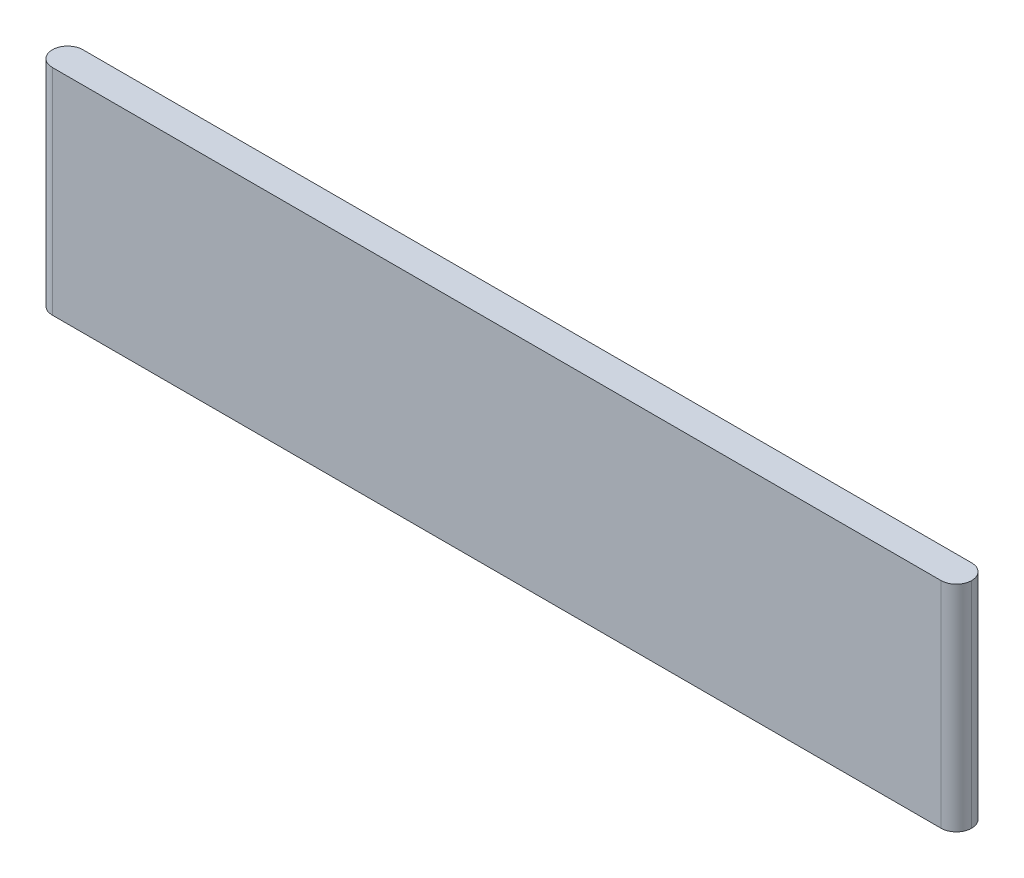
ISO-10303-21;
HEADER;
FILE_DESCRIPTION(('STEP AP214'),'2;1');
FILE_NAME('part.step','',(''),(''),'','','');
FILE_SCHEMA(('AUTOMOTIVE_DESIGN { 1 0 10303 214 1 1 1 1 }'));
ENDSEC;
DATA;
#1=APPLICATION_CONTEXT('core data for automotive mechanical design processes');
#2=APPLICATION_PROTOCOL_DEFINITION('international standard','automotive_design',2000,#1);
#3=PRODUCT_CONTEXT('',#1,'mechanical');
#4=PRODUCT('Part','Part','',(#3));
#5=PRODUCT_RELATED_PRODUCT_CATEGORY('part','',(#4));
#6=PRODUCT_DEFINITION_FORMATION('','',#4);
#7=PRODUCT_DEFINITION_CONTEXT('part definition',#1,'design');
#8=PRODUCT_DEFINITION('design','',#6,#7);
#9=PRODUCT_DEFINITION_SHAPE('','',#8);
#10=(LENGTH_UNIT() NAMED_UNIT(*) SI_UNIT(.MILLI.,.METRE.));
#11=(NAMED_UNIT(*) PLANE_ANGLE_UNIT() SI_UNIT($,.RADIAN.));
#12=(NAMED_UNIT(*) SI_UNIT($,.STERADIAN.) SOLID_ANGLE_UNIT());
#13=UNCERTAINTY_MEASURE_WITH_UNIT(LENGTH_MEASURE(1.E-05),#10,'distance_accuracy_value','');
#14=(GEOMETRIC_REPRESENTATION_CONTEXT(3) GLOBAL_UNCERTAINTY_ASSIGNED_CONTEXT((#13)) GLOBAL_UNIT_ASSIGNED_CONTEXT((#10,
#11,#12)) REPRESENTATION_CONTEXT('',''));
#15=CARTESIAN_POINT('',(0.,0.,0.));
#16=DIRECTION('',(0.,0.,1.));
#17=DIRECTION('',(1.,0.,0.));
#18=AXIS2_PLACEMENT_3D('',#15,#16,#17);
#19=CARTESIAN_POINT('',(-750.,175.,50.0000000000006));
#20=DIRECTION('',(0.,-1.,0.));
#21=DIRECTION('',(1.,0.,0.));
#22=AXIS2_PLACEMENT_3D('',#19,#20,#21);
#23=PLANE('',#22);
#24=CARTESIAN_POINT('',(725.,175.,25.0000000000006));
#25=DIRECTION('',(0.,-1.,0.));
#26=DIRECTION('',(1.,0.,0.));
#27=AXIS2_PLACEMENT_3D('',#24,#25,#26);
#28=CIRCLE('',#27,25.);
#29=CARTESIAN_POINT('',(725.,175.,50.0000000000006));
#30=VERTEX_POINT('',#29);
#31=CARTESIAN_POINT('',(750.,175.,25.0000000000006));
#32=VERTEX_POINT('',#31);
#33=EDGE_CURVE('E101',#30,#32,#28,.F.);
#34=ORIENTED_EDGE('',*,*,#33,.T.);
#35=CARTESIAN_POINT('',(725.,175.,25.0000000000006));
#36=DIRECTION('',(0.,-1.,0.));
#37=DIRECTION('',(1.,0.,0.));
#38=AXIS2_PLACEMENT_3D('',#35,#36,#37);
#39=CIRCLE('',#38,25.);
#40=CARTESIAN_POINT('',(725.,175.,6.11009234297548E-13));
#41=VERTEX_POINT('',#40);
#42=EDGE_CURVE('E96',#32,#41,#39,.F.);
#43=ORIENTED_EDGE('',*,*,#42,.T.);
#44=DIRECTION('',(-1.,0.,0.));
#45=VECTOR('',#44,1.);
#46=CARTESIAN_POINT('',(-750.,175.,6.11009234297548E-13));
#47=LINE('',#46,#45);
#48=CARTESIAN_POINT('',(-725.,175.,6.11009234297548E-13));
#49=VERTEX_POINT('',#48);
#50=EDGE_CURVE('E98',#41,#49,#47,.T.);
#51=ORIENTED_EDGE('',*,*,#50,.T.);
#52=CARTESIAN_POINT('',(-725.,175.,25.0000000000006));
#53=DIRECTION('',(0.,-1.,0.));
#54=DIRECTION('',(1.,0.,0.));
#55=AXIS2_PLACEMENT_3D('',#52,#53,#54);
#56=CIRCLE('',#55,25.);
#57=CARTESIAN_POINT('',(-750.,175.,25.0000000000006));
#58=VERTEX_POINT('',#57);
#59=EDGE_CURVE('E144',#49,#58,#56,.F.);
#60=ORIENTED_EDGE('',*,*,#59,.T.);
#61=CARTESIAN_POINT('',(-725.,175.,25.0000000000006));
#62=DIRECTION('',(0.,-1.,0.));
#63=DIRECTION('',(1.,0.,0.));
#64=AXIS2_PLACEMENT_3D('',#61,#62,#63);
#65=CIRCLE('',#64,25.);
#66=CARTESIAN_POINT('',(-725.,175.,50.0000000000006));
#67=VERTEX_POINT('',#66);
#68=EDGE_CURVE('E148',#58,#67,#65,.F.);
#69=ORIENTED_EDGE('',*,*,#68,.T.);
#70=DIRECTION('',(-1.,0.,0.));
#71=VECTOR('',#70,1.);
#72=CARTESIAN_POINT('',(-750.,175.,50.0000000000006));
#73=LINE('',#72,#71);
#74=EDGE_CURVE('E156',#30,#67,#73,.T.);
#75=ORIENTED_EDGE('',*,*,#74,.F.);
#76=EDGE_LOOP('',(#34,#43,#51,#60,#69,#75));
#77=FACE_BOUND('',#76,.T.);
#78=ADVANCED_FACE('F41',(#77),#23,.F.);
#79=CARTESIAN_POINT('',(-750.,-175.,49.9999999999994));
#80=DIRECTION('',(0.,1.,0.));
#81=DIRECTION('',(-1.,0.,0.));
#82=AXIS2_PLACEMENT_3D('',#79,#80,#81);
#83=PLANE('',#82);
#84=DIRECTION('',(1.,0.,0.));
#85=VECTOR('',#84,1.);
#86=CARTESIAN_POINT('',(-750.,-175.,-6.11009234297548E-13));
#87=LINE('',#86,#85);
#88=CARTESIAN_POINT('',(-725.,-175.,-6.11009234297548E-13));
#89=VERTEX_POINT('',#88);
#90=CARTESIAN_POINT('',(725.,-175.,-6.11009234297548E-13));
#91=VERTEX_POINT('',#90);
#92=EDGE_CURVE('E118',#89,#91,#87,.T.);
#93=ORIENTED_EDGE('',*,*,#92,.T.);
#94=CARTESIAN_POINT('',(725.,-175.,24.9999999999994));
#95=DIRECTION('',(0.,1.,0.));
#96=DIRECTION('',(-1.,0.,0.));
#97=AXIS2_PLACEMENT_3D('',#94,#95,#96);
#98=CIRCLE('',#97,25.);
#99=CARTESIAN_POINT('',(750.,-175.,24.9999999999994));
#100=VERTEX_POINT('',#99);
#101=EDGE_CURVE('E122',#91,#100,#98,.F.);
#102=ORIENTED_EDGE('',*,*,#101,.T.);
#103=CARTESIAN_POINT('',(725.,-175.,24.9999999999994));
#104=DIRECTION('',(0.,1.,0.));
#105=DIRECTION('',(-1.,0.,0.));
#106=AXIS2_PLACEMENT_3D('',#103,#104,#105);
#107=CIRCLE('',#106,25.);
#108=CARTESIAN_POINT('',(725.,-175.,49.9999999999994));
#109=VERTEX_POINT('',#108);
#110=EDGE_CURVE('E65',#100,#109,#107,.F.);
#111=ORIENTED_EDGE('',*,*,#110,.T.);
#112=DIRECTION('',(1.,0.,0.));
#113=VECTOR('',#112,1.);
#114=CARTESIAN_POINT('',(-750.,-175.,49.9999999999994));
#115=LINE('',#114,#113);
#116=CARTESIAN_POINT('',(-725.,-175.,49.9999999999994));
#117=VERTEX_POINT('',#116);
#118=EDGE_CURVE('E151',#117,#109,#115,.T.);
#119=ORIENTED_EDGE('',*,*,#118,.F.);
#120=CARTESIAN_POINT('',(-725.,-175.,24.9999999999994));
#121=DIRECTION('',(0.,1.,0.));
#122=DIRECTION('',(-1.,0.,0.));
#123=AXIS2_PLACEMENT_3D('',#120,#121,#122);
#124=CIRCLE('',#123,25.);
#125=CARTESIAN_POINT('',(-750.,-175.,24.9999999999994));
#126=VERTEX_POINT('',#125);
#127=EDGE_CURVE('E59',#117,#126,#124,.F.);
#128=ORIENTED_EDGE('',*,*,#127,.T.);
#129=CARTESIAN_POINT('',(-725.,-175.,24.9999999999994));
#130=DIRECTION('',(0.,1.,0.));
#131=DIRECTION('',(-1.,0.,0.));
#132=AXIS2_PLACEMENT_3D('',#129,#130,#131);
#133=CIRCLE('',#132,25.);
#134=EDGE_CURVE('E127',#126,#89,#133,.F.);
#135=ORIENTED_EDGE('',*,*,#134,.T.);
#136=EDGE_LOOP('',(#93,#102,#111,#119,#128,#135));
#137=FACE_BOUND('',#136,.T.);
#138=ADVANCED_FACE('F178',(#137),#83,.F.);
#139=CARTESIAN_POINT('',(0.,-1.74574066942157E-13,50.));
#140=DIRECTION('',(0.,0.,-1.));
#141=DIRECTION('',(0.,1.,0.));
#142=AXIS2_PLACEMENT_3D('',#139,#140,#141);
#143=PLANE('',#142);
#144=ORIENTED_EDGE('',*,*,#118,.T.);
#145=DIRECTION('',(0.,1.,0.));
#146=VECTOR('',#145,1.);
#147=CARTESIAN_POINT('',(725.,-1.74574066942157E-13,50.));
#148=LINE('',#147,#146);
#149=EDGE_CURVE('E11',#109,#30,#148,.T.);
#150=ORIENTED_EDGE('',*,*,#149,.T.);
#151=ORIENTED_EDGE('',*,*,#74,.T.);
#152=DIRECTION('',(0.,-1.,0.));
#153=VECTOR('',#152,1.);
#154=CARTESIAN_POINT('',(-725.,-1.74574066942157E-13,50.));
#155=LINE('',#154,#153);
#156=EDGE_CURVE('E51',#67,#117,#155,.T.);
#157=ORIENTED_EDGE('',*,*,#156,.T.);
#158=EDGE_LOOP('',(#144,#150,#151,#157));
#159=FACE_BOUND('',#158,.T.);
#160=ADVANCED_FACE('F165',(#159),#143,.F.);
#161=CARTESIAN_POINT('',(0.,0.,0.));
#162=DIRECTION('',(0.,0.,-1.));
#163=DIRECTION('',(0.,1.,0.));
#164=AXIS2_PLACEMENT_3D('',#161,#162,#163);
#165=PLANE('',#164);
#166=ORIENTED_EDGE('',*,*,#50,.F.);
#167=DIRECTION('',(0.,1.,0.));
#168=VECTOR('',#167,1.);
#169=CARTESIAN_POINT('',(725.,-175.,-6.11009234297548E-13));
#170=LINE('',#169,#168);
#171=EDGE_CURVE('E114',#41,#91,#170,.F.);
#172=ORIENTED_EDGE('',*,*,#171,.T.);
#173=ORIENTED_EDGE('',*,*,#92,.F.);
#174=DIRECTION('',(0.,-1.,0.));
#175=VECTOR('',#174,1.);
#176=CARTESIAN_POINT('',(-725.,175.,6.11009234297548E-13));
#177=LINE('',#176,#175);
#178=EDGE_CURVE('E107',#89,#49,#177,.F.);
#179=ORIENTED_EDGE('',*,*,#178,.T.);
#180=EDGE_LOOP('',(#166,#172,#173,#179));
#181=FACE_BOUND('',#180,.T.);
#182=ADVANCED_FACE('F112',(#181),#165,.T.);
#183=CARTESIAN_POINT('',(725.,0.,25.));
#184=DIRECTION('',(0.,1.,0.));
#185=DIRECTION('',(-1.,0.,0.));
#186=AXIS2_PLACEMENT_3D('',#183,#184,#185);
#187=CYLINDRICAL_SURFACE('',#186,25.);
#188=ORIENTED_EDGE('',*,*,#149,.F.);
#189=ORIENTED_EDGE('',*,*,#110,.F.);
#190=DIRECTION('',(0.,1.,0.));
#191=VECTOR('',#190,1.);
#192=CARTESIAN_POINT('',(750.,-175.,24.9999999999994));
#193=LINE('',#192,#191);
#194=EDGE_CURVE('E119',#32,#100,#193,.F.);
#195=ORIENTED_EDGE('',*,*,#194,.F.);
#196=ORIENTED_EDGE('',*,*,#33,.F.);
#197=EDGE_LOOP('',(#188,#189,#195,#196));
#198=FACE_BOUND('',#197,.T.);
#199=ADVANCED_FACE('F168',(#198),#187,.T.);
#200=CARTESIAN_POINT('',(725.,-175.,24.9999999999994));
#201=DIRECTION('',(0.,-1.,0.));
#202=DIRECTION('',(1.,0.,0.));
#203=AXIS2_PLACEMENT_3D('',#200,#201,#202);
#204=CYLINDRICAL_SURFACE('',#203,25.);
#205=ORIENTED_EDGE('',*,*,#101,.F.);
#206=ORIENTED_EDGE('',*,*,#171,.F.);
#207=ORIENTED_EDGE('',*,*,#42,.F.);
#208=ORIENTED_EDGE('',*,*,#194,.T.);
#209=EDGE_LOOP('',(#205,#206,#207,#208));
#210=FACE_BOUND('',#209,.T.);
#211=ADVANCED_FACE('F121',(#210),#204,.T.);
#212=CARTESIAN_POINT('',(-725.,0.,25.));
#213=DIRECTION('',(0.,-1.,0.));
#214=DIRECTION('',(1.,0.,0.));
#215=AXIS2_PLACEMENT_3D('',#212,#213,#214);
#216=CYLINDRICAL_SURFACE('',#215,25.);
#217=ORIENTED_EDGE('',*,*,#156,.F.);
#218=ORIENTED_EDGE('',*,*,#68,.F.);
#219=DIRECTION('',(0.,-1.,0.));
#220=VECTOR('',#219,1.);
#221=CARTESIAN_POINT('',(-750.,-175.,24.9999999999994));
#222=LINE('',#221,#220);
#223=EDGE_CURVE('E45',#126,#58,#222,.F.);
#224=ORIENTED_EDGE('',*,*,#223,.F.);
#225=ORIENTED_EDGE('',*,*,#127,.F.);
#226=EDGE_LOOP('',(#217,#218,#224,#225));
#227=FACE_BOUND('',#226,.T.);
#228=ADVANCED_FACE('F43',(#227),#216,.T.);
#229=CARTESIAN_POINT('',(-725.,-175.,24.9999999999994));
#230=DIRECTION('',(0.,1.,0.));
#231=DIRECTION('',(-1.,0.,0.));
#232=AXIS2_PLACEMENT_3D('',#229,#230,#231);
#233=CYLINDRICAL_SURFACE('',#232,25.);
#234=ORIENTED_EDGE('',*,*,#59,.F.);
#235=ORIENTED_EDGE('',*,*,#178,.F.);
#236=ORIENTED_EDGE('',*,*,#134,.F.);
#237=ORIENTED_EDGE('',*,*,#223,.T.);
#238=EDGE_LOOP('',(#234,#235,#236,#237));
#239=FACE_BOUND('',#238,.T.);
#240=ADVANCED_FACE('F143',(#239),#233,.T.);
#241=CLOSED_SHELL('',(#78,#138,#160,#182,#199,#211,#228,#240));
#242=MANIFOLD_SOLID_BREP('B2',#241);
#243=ADVANCED_BREP_SHAPE_REPRESENTATION('',(#18,#242),#14);
#244=SHAPE_DEFINITION_REPRESENTATION(#9,#243);
ENDSEC;
END-ISO-10303-21;
